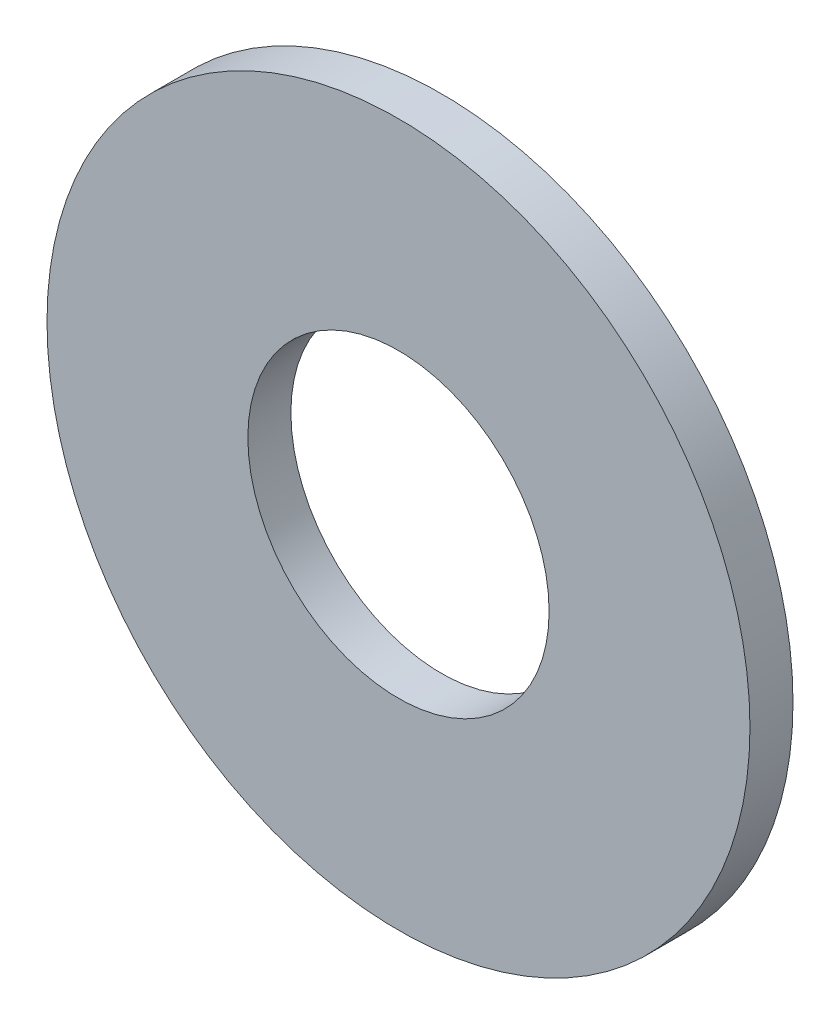
ISO-10303-21;
HEADER;
FILE_DESCRIPTION(('STEP AP214'),'2;1');
FILE_NAME('part.step','',(''),(''),'','','');
FILE_SCHEMA(('AUTOMOTIVE_DESIGN { 1 0 10303 214 1 1 1 1 }'));
ENDSEC;
DATA;
#1=APPLICATION_CONTEXT('core data for automotive mechanical design processes');
#2=APPLICATION_PROTOCOL_DEFINITION('international standard','automotive_design',2000,#1);
#3=PRODUCT_CONTEXT('',#1,'mechanical');
#4=PRODUCT('Part','Part','',(#3));
#5=PRODUCT_RELATED_PRODUCT_CATEGORY('part','',(#4));
#6=PRODUCT_DEFINITION_FORMATION('','',#4);
#7=PRODUCT_DEFINITION_CONTEXT('part definition',#1,'design');
#8=PRODUCT_DEFINITION('design','',#6,#7);
#9=PRODUCT_DEFINITION_SHAPE('','',#8);
#10=(LENGTH_UNIT() NAMED_UNIT(*) SI_UNIT(.MILLI.,.METRE.));
#11=(NAMED_UNIT(*) PLANE_ANGLE_UNIT() SI_UNIT($,.RADIAN.));
#12=(NAMED_UNIT(*) SI_UNIT($,.STERADIAN.) SOLID_ANGLE_UNIT());
#13=UNCERTAINTY_MEASURE_WITH_UNIT(LENGTH_MEASURE(1.E-05),#10,'distance_accuracy_value','');
#14=(GEOMETRIC_REPRESENTATION_CONTEXT(3) GLOBAL_UNCERTAINTY_ASSIGNED_CONTEXT((#13)) GLOBAL_UNIT_ASSIGNED_CONTEXT((#10,
#11,#12)) REPRESENTATION_CONTEXT('',''));
#15=CARTESIAN_POINT('',(0.,0.,0.));
#16=DIRECTION('',(0.,0.,1.));
#17=DIRECTION('',(1.,0.,0.));
#18=AXIS2_PLACEMENT_3D('',#15,#16,#17);
#19=CARTESIAN_POINT('',(0.,0.,0.3));
#20=DIRECTION('',(0.,0.,1.));
#21=DIRECTION('',(1.,0.,0.));
#22=AXIS2_PLACEMENT_3D('',#19,#20,#21);
#23=PLANE('',#22);
#24=CARTESIAN_POINT('',(0.,0.,0.3));
#25=DIRECTION('',(0.,0.,1.));
#26=DIRECTION('',(1.,0.,0.));
#27=AXIS2_PLACEMENT_3D('',#24,#25,#26);
#28=CIRCLE('',#27,2.45);
#29=CARTESIAN_POINT('',(2.45,0.,0.3));
#30=VERTEX_POINT('',#29);
#31=EDGE_CURVE('E10',#30,#30,#28,.T.);
#32=ORIENTED_EDGE('',*,*,#31,.T.);
#33=EDGE_LOOP('',(#32));
#34=FACE_BOUND('',#33,.T.);
#35=CARTESIAN_POINT('',(0.,0.,0.3));
#36=DIRECTION('',(0.,0.,1.));
#37=DIRECTION('',(1.,0.,0.));
#38=AXIS2_PLACEMENT_3D('',#35,#36,#37);
#39=CIRCLE('',#38,1.05);
#40=CARTESIAN_POINT('',(1.05,0.,0.3));
#41=VERTEX_POINT('',#40);
#42=EDGE_CURVE('E50',#41,#41,#39,.T.);
#43=ORIENTED_EDGE('',*,*,#42,.F.);
#44=EDGE_LOOP('',(#43));
#45=FACE_BOUND('',#44,.T.);
#46=ADVANCED_FACE('F37',(#34,#45),#23,.T.);
#47=CARTESIAN_POINT('',(0.,0.,0.));
#48=DIRECTION('',(0.,0.,1.));
#49=DIRECTION('',(1.,0.,0.));
#50=AXIS2_PLACEMENT_3D('',#47,#48,#49);
#51=PLANE('',#50);
#52=CARTESIAN_POINT('',(0.,0.,0.));
#53=DIRECTION('',(0.,0.,1.));
#54=DIRECTION('',(1.,0.,0.));
#55=AXIS2_PLACEMENT_3D('',#52,#53,#54);
#56=CIRCLE('',#55,2.45);
#57=CARTESIAN_POINT('',(2.45,0.,0.));
#58=VERTEX_POINT('',#57);
#59=EDGE_CURVE('E41',#58,#58,#56,.T.);
#60=ORIENTED_EDGE('',*,*,#59,.F.);
#61=EDGE_LOOP('',(#60));
#62=FACE_BOUND('',#61,.T.);
#63=CARTESIAN_POINT('',(0.,0.,0.));
#64=DIRECTION('',(0.,0.,1.));
#65=DIRECTION('',(1.,0.,0.));
#66=AXIS2_PLACEMENT_3D('',#63,#64,#65);
#67=CIRCLE('',#66,1.05);
#68=CARTESIAN_POINT('',(1.05,0.,0.));
#69=VERTEX_POINT('',#68);
#70=EDGE_CURVE('E52',#69,#69,#67,.T.);
#71=ORIENTED_EDGE('',*,*,#70,.T.);
#72=EDGE_LOOP('',(#71));
#73=FACE_BOUND('',#72,.T.);
#74=ADVANCED_FACE('F64',(#62,#73),#51,.F.);
#75=CARTESIAN_POINT('',(0.,0.,0.3));
#76=DIRECTION('',(0.,0.,-1.));
#77=DIRECTION('',(-1.,0.,0.));
#78=AXIS2_PLACEMENT_3D('',#75,#76,#77);
#79=CYLINDRICAL_SURFACE('',#78,2.45);
#80=ORIENTED_EDGE('',*,*,#31,.F.);
#81=EDGE_LOOP('',(#80));
#82=FACE_BOUND('',#81,.T.);
#83=ORIENTED_EDGE('',*,*,#59,.T.);
#84=EDGE_LOOP('',(#83));
#85=FACE_BOUND('',#84,.T.);
#86=ADVANCED_FACE('F39',(#82,#85),#79,.T.);
#87=CARTESIAN_POINT('',(0.,0.,0.3));
#88=DIRECTION('',(0.,0.,-1.));
#89=DIRECTION('',(-1.,0.,0.));
#90=AXIS2_PLACEMENT_3D('',#87,#88,#89);
#91=CYLINDRICAL_SURFACE('',#90,1.05);
#92=ORIENTED_EDGE('',*,*,#42,.T.);
#93=EDGE_LOOP('',(#92));
#94=FACE_BOUND('',#93,.T.);
#95=ORIENTED_EDGE('',*,*,#70,.F.);
#96=EDGE_LOOP('',(#95));
#97=FACE_BOUND('',#96,.T.);
#98=ADVANCED_FACE('F60',(#94,#97),#91,.F.);
#99=CLOSED_SHELL('',(#46,#74,#86,#98));
#100=MANIFOLD_SOLID_BREP('B2',#99);
#101=ADVANCED_BREP_SHAPE_REPRESENTATION('',(#18,#100),#14);
#102=SHAPE_DEFINITION_REPRESENTATION(#9,#101);
ENDSEC;
END-ISO-10303-21;
